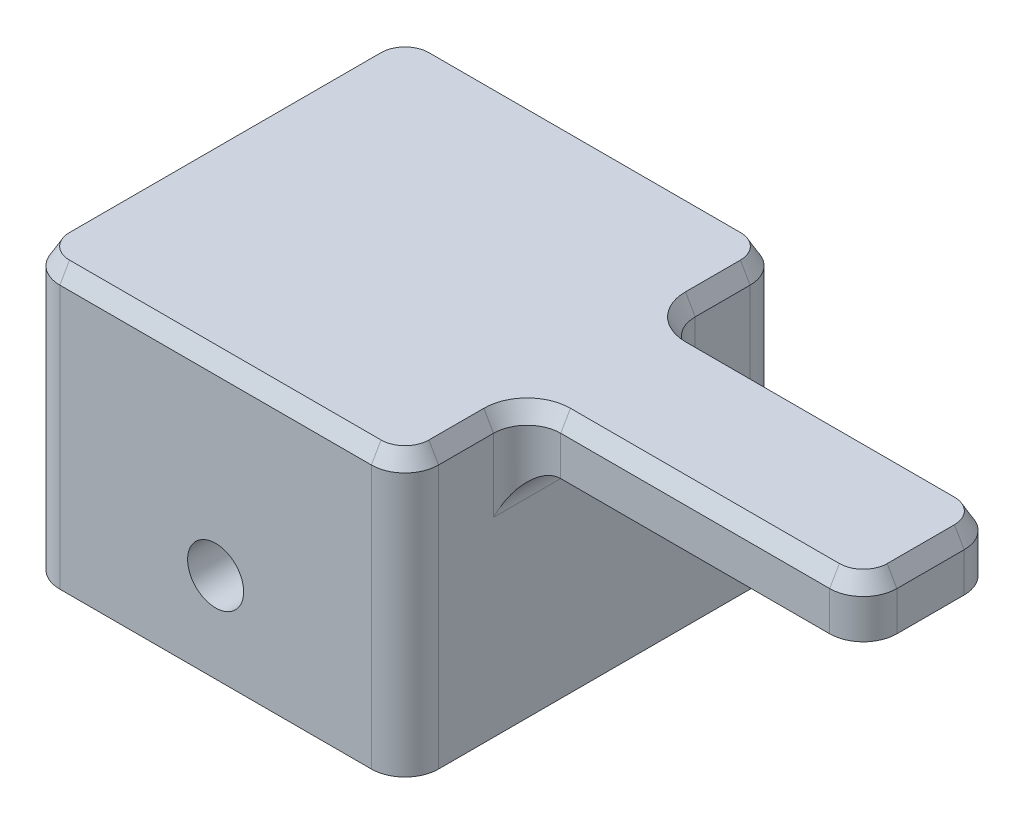
ISO-10303-21;
HEADER;
FILE_DESCRIPTION(('STEP AP214'),'2;1');
FILE_NAME('part.step','',(''),(''),'','','');
FILE_SCHEMA(('AUTOMOTIVE_DESIGN { 1 0 10303 214 1 1 1 1 }'));
ENDSEC;
DATA;
#1=APPLICATION_CONTEXT('core data for automotive mechanical design processes');
#2=APPLICATION_PROTOCOL_DEFINITION('international standard','automotive_design',2000,#1);
#3=PRODUCT_CONTEXT('',#1,'mechanical');
#4=PRODUCT('Part','Part','',(#3));
#5=PRODUCT_RELATED_PRODUCT_CATEGORY('part','',(#4));
#6=PRODUCT_DEFINITION_FORMATION('','',#4);
#7=PRODUCT_DEFINITION_CONTEXT('part definition',#1,'design');
#8=PRODUCT_DEFINITION('design','',#6,#7);
#9=PRODUCT_DEFINITION_SHAPE('','',#8);
#10=(LENGTH_UNIT() NAMED_UNIT(*) SI_UNIT(.MILLI.,.METRE.));
#11=(NAMED_UNIT(*) PLANE_ANGLE_UNIT() SI_UNIT($,.RADIAN.));
#12=(NAMED_UNIT(*) SI_UNIT($,.STERADIAN.) SOLID_ANGLE_UNIT());
#13=UNCERTAINTY_MEASURE_WITH_UNIT(LENGTH_MEASURE(1.E-05),#10,'distance_accuracy_value','');
#14=(GEOMETRIC_REPRESENTATION_CONTEXT(3) GLOBAL_UNCERTAINTY_ASSIGNED_CONTEXT((#13)) GLOBAL_UNIT_ASSIGNED_CONTEXT((#10,
#11,#12)) REPRESENTATION_CONTEXT('',''));
#15=CARTESIAN_POINT('',(0.,0.,0.));
#16=DIRECTION('',(0.,0.,1.));
#17=DIRECTION('',(1.,0.,0.));
#18=AXIS2_PLACEMENT_3D('',#15,#16,#17);
#19=CARTESIAN_POINT('',(0.,0.,0.));
#20=DIRECTION('',(0.,1.,0.));
#21=DIRECTION('',(0.,0.,1.));
#22=AXIS2_PLACEMENT_3D('',#19,#20,#21);
#23=PLANE('',#22);
#24=DIRECTION('',(0.,0.,-1.));
#25=VECTOR('',#24,1.);
#26=CARTESIAN_POINT('',(16.9,0.,16.9));
#27=LINE('',#26,#25);
#28=CARTESIAN_POINT('',(16.9,0.,13.9));
#29=VERTEX_POINT('',#28);
#30=CARTESIAN_POINT('',(16.9,0.,-13.9));
#31=VERTEX_POINT('',#30);
#32=EDGE_CURVE('E272',#29,#31,#27,.T.);
#33=ORIENTED_EDGE('',*,*,#32,.F.);
#34=CARTESIAN_POINT('',(13.9,0.,13.9));
#35=DIRECTION('',(0.,1.,0.));
#36=DIRECTION('',(0.,0.,1.));
#37=AXIS2_PLACEMENT_3D('',#34,#35,#36);
#38=CIRCLE('',#37,3.);
#39=CARTESIAN_POINT('',(13.9,0.,16.9));
#40=VERTEX_POINT('',#39);
#41=EDGE_CURVE('E310',#29,#40,#38,.F.);
#42=ORIENTED_EDGE('',*,*,#41,.T.);
#43=DIRECTION('',(1.,0.,0.));
#44=VECTOR('',#43,1.);
#45=CARTESIAN_POINT('',(-16.9,0.,16.9));
#46=LINE('',#45,#44);
#47=CARTESIAN_POINT('',(-13.9,0.,16.9));
#48=VERTEX_POINT('',#47);
#49=EDGE_CURVE('E263',#48,#40,#46,.T.);
#50=ORIENTED_EDGE('',*,*,#49,.F.);
#51=CARTESIAN_POINT('',(-13.9,0.,13.9));
#52=DIRECTION('',(0.,1.,0.));
#53=DIRECTION('',(0.,0.,1.));
#54=AXIS2_PLACEMENT_3D('',#51,#52,#53);
#55=CIRCLE('',#54,3.);
#56=CARTESIAN_POINT('',(-16.9,0.,13.9));
#57=VERTEX_POINT('',#56);
#58=EDGE_CURVE('E307',#48,#57,#55,.F.);
#59=ORIENTED_EDGE('',*,*,#58,.T.);
#60=DIRECTION('',(0.,0.,1.));
#61=VECTOR('',#60,1.);
#62=CARTESIAN_POINT('',(-16.9,0.,16.9));
#63=LINE('',#62,#61);
#64=CARTESIAN_POINT('',(-16.9,0.,-13.9));
#65=VERTEX_POINT('',#64);
#66=EDGE_CURVE('E280',#65,#57,#63,.T.);
#67=ORIENTED_EDGE('',*,*,#66,.F.);
#68=CARTESIAN_POINT('',(-13.9,0.,-13.9));
#69=DIRECTION('',(0.,1.,0.));
#70=DIRECTION('',(0.,0.,1.));
#71=AXIS2_PLACEMENT_3D('',#68,#69,#70);
#72=CIRCLE('',#71,3.);
#73=CARTESIAN_POINT('',(-13.9,0.,-16.9));
#74=VERTEX_POINT('',#73);
#75=EDGE_CURVE('E304',#65,#74,#72,.F.);
#76=ORIENTED_EDGE('',*,*,#75,.T.);
#77=DIRECTION('',(-1.,0.,0.));
#78=VECTOR('',#77,1.);
#79=CARTESIAN_POINT('',(-16.9,0.,-16.9));
#80=LINE('',#79,#78);
#81=CARTESIAN_POINT('',(13.9,0.,-16.9));
#82=VERTEX_POINT('',#81);
#83=EDGE_CURVE('E276',#82,#74,#80,.T.);
#84=ORIENTED_EDGE('',*,*,#83,.F.);
#85=CARTESIAN_POINT('',(13.9,0.,-13.9));
#86=DIRECTION('',(0.,1.,0.));
#87=DIRECTION('',(0.,0.,1.));
#88=AXIS2_PLACEMENT_3D('',#85,#86,#87);
#89=CIRCLE('',#88,3.);
#90=EDGE_CURVE('E301',#82,#31,#89,.F.);
#91=ORIENTED_EDGE('',*,*,#90,.T.);
#92=EDGE_LOOP('',(#33,#42,#50,#59,#67,#76,#84,#91));
#93=FACE_BOUND('',#92,.T.);
#94=DIRECTION('',(0.,0.,-1.));
#95=VECTOR('',#94,1.);
#96=CARTESIAN_POINT('',(12.9,0.,12.9));
#97=LINE('',#96,#95);
#98=CARTESIAN_POINT('',(12.9,0.,12.9));
#99=VERTEX_POINT('',#98);
#100=CARTESIAN_POINT('',(12.9,0.,-12.9));
#101=VERTEX_POINT('',#100);
#102=EDGE_CURVE('E555',#99,#101,#97,.T.);
#103=ORIENTED_EDGE('',*,*,#102,.T.);
#104=DIRECTION('',(-1.,0.,0.));
#105=VECTOR('',#104,1.);
#106=CARTESIAN_POINT('',(-12.9,0.,-12.9));
#107=LINE('',#106,#105);
#108=CARTESIAN_POINT('',(-12.9,0.,-12.9));
#109=VERTEX_POINT('',#108);
#110=EDGE_CURVE('E570',#101,#109,#107,.T.);
#111=ORIENTED_EDGE('',*,*,#110,.T.);
#112=DIRECTION('',(0.,0.,1.));
#113=VECTOR('',#112,1.);
#114=CARTESIAN_POINT('',(-12.9,0.,12.9));
#115=LINE('',#114,#113);
#116=CARTESIAN_POINT('',(-12.9,0.,12.9));
#117=VERTEX_POINT('',#116);
#118=EDGE_CURVE('E256',#109,#117,#115,.T.);
#119=ORIENTED_EDGE('',*,*,#118,.T.);
#120=DIRECTION('',(1.,0.,0.));
#121=VECTOR('',#120,1.);
#122=CARTESIAN_POINT('',(-12.9,0.,12.9));
#123=LINE('',#122,#121);
#124=EDGE_CURVE('E563',#117,#99,#123,.T.);
#125=ORIENTED_EDGE('',*,*,#124,.T.);
#126=EDGE_LOOP('',(#103,#111,#119,#125));
#127=FACE_BOUND('',#126,.T.);
#128=ADVANCED_FACE('F43',(#93,#127),#23,.F.);
#129=CARTESIAN_POINT('',(-16.9,20.,16.9));
#130=DIRECTION('',(0.,0.,-1.));
#131=DIRECTION('',(-1.,0.,0.));
#132=AXIS2_PLACEMENT_3D('',#129,#130,#131);
#133=PLANE('',#132);
#134=CARTESIAN_POINT('',(0.,8.,16.9));
#135=DIRECTION('',(0.,0.,1.));
#136=DIRECTION('',(1.,0.,0.));
#137=AXIS2_PLACEMENT_3D('',#134,#135,#136);
#138=CIRCLE('',#137,2.5);
#139=CARTESIAN_POINT('',(2.5,8.,16.9));
#140=VERTEX_POINT('',#139);
#141=EDGE_CURVE('E558',#140,#140,#138,.T.);
#142=ORIENTED_EDGE('',*,*,#141,.F.);
#143=EDGE_LOOP('',(#142));
#144=FACE_BOUND('',#143,.T.);
#145=DIRECTION('',(0.,-1.,0.));
#146=VECTOR('',#145,1.);
#147=CARTESIAN_POINT('',(13.9,20.,16.9));
#148=LINE('',#147,#146);
#149=CARTESIAN_POINT('',(13.9,23.5,16.9));
#150=VERTEX_POINT('',#149);
#151=EDGE_CURVE('E316',#40,#150,#148,.F.);
#152=ORIENTED_EDGE('',*,*,#151,.T.);
#153=DIRECTION('',(-1.,0.,0.));
#154=VECTOR('',#153,1.);
#155=CARTESIAN_POINT('',(-13.9,23.5,16.9));
#156=LINE('',#155,#154);
#157=CARTESIAN_POINT('',(-13.9,23.5,16.9));
#158=VERTEX_POINT('',#157);
#159=EDGE_CURVE('E11',#150,#158,#156,.T.);
#160=ORIENTED_EDGE('',*,*,#159,.T.);
#161=DIRECTION('',(0.,-1.,0.));
#162=VECTOR('',#161,1.);
#163=CARTESIAN_POINT('',(-13.9,20.,16.9));
#164=LINE('',#163,#162);
#165=EDGE_CURVE('E313',#158,#48,#164,.T.);
#166=ORIENTED_EDGE('',*,*,#165,.T.);
#167=ORIENTED_EDGE('',*,*,#49,.T.);
#168=EDGE_LOOP('',(#152,#160,#166,#167));
#169=FACE_BOUND('',#168,.T.);
#170=ADVANCED_FACE('F599',(#144,#169),#133,.F.);
#171=CARTESIAN_POINT('',(16.9,20.,16.9));
#172=DIRECTION('',(-1.,0.,0.));
#173=DIRECTION('',(0.,0.,1.));
#174=AXIS2_PLACEMENT_3D('',#171,#172,#173);
#175=PLANE('',#174);
#176=DIRECTION('',(0.,-1.,0.));
#177=VECTOR('',#176,1.);
#178=CARTESIAN_POINT('',(16.9,20.,-13.9));
#179=LINE('',#178,#177);
#180=CARTESIAN_POINT('',(16.9,23.5,-13.9));
#181=VERTEX_POINT('',#180);
#182=EDGE_CURVE('E294',#31,#181,#179,.F.);
#183=ORIENTED_EDGE('',*,*,#182,.T.);
#184=DIRECTION('',(0.,0.,1.));
#185=VECTOR('',#184,1.);
#186=CARTESIAN_POINT('',(16.9,23.5,-9.));
#187=LINE('',#186,#185);
#188=CARTESIAN_POINT('',(16.9,23.5,-9.));
#189=VERTEX_POINT('',#188);
#190=EDGE_CURVE('E439',#181,#189,#187,.T.);
#191=ORIENTED_EDGE('',*,*,#190,.T.);
#192=DIRECTION('',(0.,-1.,0.));
#193=VECTOR('',#192,1.);
#194=CARTESIAN_POINT('',(16.9,20.,-9.));
#195=LINE('',#194,#193);
#196=CARTESIAN_POINT('',(16.9,17.,-9.));
#197=VERTEX_POINT('',#196);
#198=EDGE_CURVE('E291',#189,#197,#195,.T.);
#199=ORIENTED_EDGE('',*,*,#198,.T.);
#200=DIRECTION('',(0.,0.,-1.));
#201=VECTOR('',#200,1.);
#202=CARTESIAN_POINT('',(16.9,17.,6.));
#203=LINE('',#202,#201);
#204=CARTESIAN_POINT('',(16.9,17.,9.));
#205=VERTEX_POINT('',#204);
#206=EDGE_CURVE('E284',#197,#205,#203,.F.);
#207=ORIENTED_EDGE('',*,*,#206,.T.);
#208=DIRECTION('',(0.,-1.,0.));
#209=VECTOR('',#208,1.);
#210=CARTESIAN_POINT('',(16.9,20.,9.));
#211=LINE('',#210,#209);
#212=CARTESIAN_POINT('',(16.9,23.5,9.));
#213=VERTEX_POINT('',#212);
#214=EDGE_CURVE('E287',#205,#213,#211,.F.);
#215=ORIENTED_EDGE('',*,*,#214,.T.);
#216=DIRECTION('',(0.,0.,1.));
#217=VECTOR('',#216,1.);
#218=CARTESIAN_POINT('',(16.9,23.5,13.9));
#219=LINE('',#218,#217);
#220=CARTESIAN_POINT('',(16.9,23.5,13.9));
#221=VERTEX_POINT('',#220);
#222=EDGE_CURVE('E436',#213,#221,#219,.T.);
#223=ORIENTED_EDGE('',*,*,#222,.T.);
#224=DIRECTION('',(0.,-1.,0.));
#225=VECTOR('',#224,1.);
#226=CARTESIAN_POINT('',(16.9,20.,13.9));
#227=LINE('',#226,#225);
#228=EDGE_CURVE('E298',#221,#29,#227,.T.);
#229=ORIENTED_EDGE('',*,*,#228,.T.);
#230=ORIENTED_EDGE('',*,*,#32,.T.);
#231=EDGE_LOOP('',(#183,#191,#199,#207,#215,#223,#229,#230));
#232=FACE_BOUND('',#231,.T.);
#233=ADVANCED_FACE('F604',(#232),#175,.F.);
#234=CARTESIAN_POINT('',(-16.9,20.,-16.9));
#235=DIRECTION('',(0.,0.,1.));
#236=DIRECTION('',(1.,0.,0.));
#237=AXIS2_PLACEMENT_3D('',#234,#235,#236);
#238=PLANE('',#237);
#239=DIRECTION('',(0.,-1.,0.));
#240=VECTOR('',#239,1.);
#241=CARTESIAN_POINT('',(-13.9,20.,-16.9));
#242=LINE('',#241,#240);
#243=CARTESIAN_POINT('',(-13.9,23.5,-16.9));
#244=VERTEX_POINT('',#243);
#245=EDGE_CURVE('E329',#74,#244,#242,.F.);
#246=ORIENTED_EDGE('',*,*,#245,.T.);
#247=DIRECTION('',(1.,0.,0.));
#248=VECTOR('',#247,1.);
#249=CARTESIAN_POINT('',(13.9,23.5,-16.9));
#250=LINE('',#249,#248);
#251=CARTESIAN_POINT('',(13.9,23.5,-16.9));
#252=VERTEX_POINT('',#251);
#253=EDGE_CURVE('E430',#244,#252,#250,.T.);
#254=ORIENTED_EDGE('',*,*,#253,.T.);
#255=DIRECTION('',(0.,-1.,0.));
#256=VECTOR('',#255,1.);
#257=CARTESIAN_POINT('',(13.9,20.,-16.9));
#258=LINE('',#257,#256);
#259=EDGE_CURVE('E326',#252,#82,#258,.T.);
#260=ORIENTED_EDGE('',*,*,#259,.T.);
#261=ORIENTED_EDGE('',*,*,#83,.T.);
#262=EDGE_LOOP('',(#246,#254,#260,#261));
#263=FACE_BOUND('',#262,.T.);
#264=ADVANCED_FACE('F594',(#263),#238,.F.);
#265=CARTESIAN_POINT('',(-16.9,20.,16.9));
#266=DIRECTION('',(1.,0.,0.));
#267=DIRECTION('',(0.,0.,-1.));
#268=AXIS2_PLACEMENT_3D('',#265,#266,#267);
#269=PLANE('',#268);
#270=DIRECTION('',(0.,-1.,0.));
#271=VECTOR('',#270,1.);
#272=CARTESIAN_POINT('',(-16.9,20.,13.9));
#273=LINE('',#272,#271);
#274=CARTESIAN_POINT('',(-16.9,23.5,13.9));
#275=VERTEX_POINT('',#274);
#276=EDGE_CURVE('E322',#57,#275,#273,.F.);
#277=ORIENTED_EDGE('',*,*,#276,.T.);
#278=DIRECTION('',(0.,0.,-1.));
#279=VECTOR('',#278,1.);
#280=CARTESIAN_POINT('',(-16.9,23.5,-13.9));
#281=LINE('',#280,#279);
#282=CARTESIAN_POINT('',(-16.9,23.5,-13.9));
#283=VERTEX_POINT('',#282);
#284=EDGE_CURVE('E424',#275,#283,#281,.T.);
#285=ORIENTED_EDGE('',*,*,#284,.T.);
#286=DIRECTION('',(0.,-1.,0.));
#287=VECTOR('',#286,1.);
#288=CARTESIAN_POINT('',(-16.9,20.,-13.9));
#289=LINE('',#288,#287);
#290=EDGE_CURVE('E319',#283,#65,#289,.T.);
#291=ORIENTED_EDGE('',*,*,#290,.T.);
#292=ORIENTED_EDGE('',*,*,#66,.T.);
#293=EDGE_LOOP('',(#277,#285,#291,#292));
#294=FACE_BOUND('',#293,.T.);
#295=ADVANCED_FACE('F587',(#294),#269,.F.);
#296=CARTESIAN_POINT('',(12.9,20.,12.9));
#297=DIRECTION('',(-1.,0.,0.));
#298=DIRECTION('',(0.,0.,1.));
#299=AXIS2_PLACEMENT_3D('',#296,#297,#298);
#300=PLANE('',#299);
#301=ORIENTED_EDGE('',*,*,#102,.F.);
#302=DIRECTION('',(0.,-1.,0.));
#303=VECTOR('',#302,1.);
#304=CARTESIAN_POINT('',(12.9,20.,12.9));
#305=LINE('',#304,#303);
#306=CARTESIAN_POINT('',(12.9,20.,12.9));
#307=VERTEX_POINT('',#306);
#308=EDGE_CURVE('E265',#307,#99,#305,.T.);
#309=ORIENTED_EDGE('',*,*,#308,.F.);
#310=DIRECTION('',(0.,0.,-1.));
#311=VECTOR('',#310,1.);
#312=CARTESIAN_POINT('',(12.9,20.,12.9));
#313=LINE('',#312,#311);
#314=CARTESIAN_POINT('',(12.9,20.,-12.9));
#315=VERTEX_POINT('',#314);
#316=EDGE_CURVE('E252',#307,#315,#313,.T.);
#317=ORIENTED_EDGE('',*,*,#316,.T.);
#318=DIRECTION('',(0.,-1.,0.));
#319=VECTOR('',#318,1.);
#320=CARTESIAN_POINT('',(12.9,20.,-12.9));
#321=LINE('',#320,#319);
#322=EDGE_CURVE('E250',#315,#101,#321,.T.);
#323=ORIENTED_EDGE('',*,*,#322,.T.);
#324=EDGE_LOOP('',(#301,#309,#317,#323));
#325=FACE_BOUND('',#324,.T.);
#326=ADVANCED_FACE('F585',(#325),#300,.T.);
#327=CARTESIAN_POINT('',(-12.9,20.,-12.9));
#328=DIRECTION('',(0.,0.,1.));
#329=DIRECTION('',(1.,0.,0.));
#330=AXIS2_PLACEMENT_3D('',#327,#328,#329);
#331=PLANE('',#330);
#332=ORIENTED_EDGE('',*,*,#110,.F.);
#333=ORIENTED_EDGE('',*,*,#322,.F.);
#334=DIRECTION('',(-1.,0.,0.));
#335=VECTOR('',#334,1.);
#336=CARTESIAN_POINT('',(-12.9,20.,-12.9));
#337=LINE('',#336,#335);
#338=CARTESIAN_POINT('',(-12.9,20.,-12.9));
#339=VERTEX_POINT('',#338);
#340=EDGE_CURVE('E235',#315,#339,#337,.T.);
#341=ORIENTED_EDGE('',*,*,#340,.T.);
#342=DIRECTION('',(0.,-1.,0.));
#343=VECTOR('',#342,1.);
#344=CARTESIAN_POINT('',(-12.9,20.,-12.9));
#345=LINE('',#344,#343);
#346=EDGE_CURVE('E247',#339,#109,#345,.T.);
#347=ORIENTED_EDGE('',*,*,#346,.T.);
#348=EDGE_LOOP('',(#332,#333,#341,#347));
#349=FACE_BOUND('',#348,.T.);
#350=ADVANCED_FACE('F246',(#349),#331,.T.);
#351=CARTESIAN_POINT('',(-12.9,20.,12.9));
#352=DIRECTION('',(1.,0.,0.));
#353=DIRECTION('',(0.,0.,-1.));
#354=AXIS2_PLACEMENT_3D('',#351,#352,#353);
#355=PLANE('',#354);
#356=ORIENTED_EDGE('',*,*,#118,.F.);
#357=ORIENTED_EDGE('',*,*,#346,.F.);
#358=DIRECTION('',(0.,0.,1.));
#359=VECTOR('',#358,1.);
#360=CARTESIAN_POINT('',(-12.9,20.,12.9));
#361=LINE('',#360,#359);
#362=CARTESIAN_POINT('',(-12.9,20.,12.9));
#363=VERTEX_POINT('',#362);
#364=EDGE_CURVE('E232',#339,#363,#361,.T.);
#365=ORIENTED_EDGE('',*,*,#364,.T.);
#366=DIRECTION('',(0.,-1.,0.));
#367=VECTOR('',#366,1.);
#368=CARTESIAN_POINT('',(-12.9,20.,12.9));
#369=LINE('',#368,#367);
#370=EDGE_CURVE('E259',#363,#117,#369,.T.);
#371=ORIENTED_EDGE('',*,*,#370,.T.);
#372=EDGE_LOOP('',(#356,#357,#365,#371));
#373=FACE_BOUND('',#372,.T.);
#374=ADVANCED_FACE('F254',(#373),#355,.T.);
#375=CARTESIAN_POINT('',(-12.9,20.,12.9));
#376=DIRECTION('',(0.,0.,-1.));
#377=DIRECTION('',(-1.,0.,0.));
#378=AXIS2_PLACEMENT_3D('',#375,#376,#377);
#379=PLANE('',#378);
#380=CARTESIAN_POINT('',(0.,8.,12.9));
#381=DIRECTION('',(0.,0.,-1.));
#382=DIRECTION('',(-1.,0.,0.));
#383=AXIS2_PLACEMENT_3D('',#380,#381,#382);
#384=CIRCLE('',#383,2.5);
#385=CARTESIAN_POINT('',(-2.5,8.,12.9));
#386=VERTEX_POINT('',#385);
#387=EDGE_CURVE('E371',#386,#386,#384,.F.);
#388=ORIENTED_EDGE('',*,*,#387,.T.);
#389=EDGE_LOOP('',(#388));
#390=FACE_BOUND('',#389,.T.);
#391=ORIENTED_EDGE('',*,*,#124,.F.);
#392=ORIENTED_EDGE('',*,*,#370,.F.);
#393=DIRECTION('',(1.,0.,0.));
#394=VECTOR('',#393,1.);
#395=CARTESIAN_POINT('',(-12.9,20.,12.9));
#396=LINE('',#395,#394);
#397=EDGE_CURVE('E238',#363,#307,#396,.T.);
#398=ORIENTED_EDGE('',*,*,#397,.T.);
#399=ORIENTED_EDGE('',*,*,#308,.T.);
#400=EDGE_LOOP('',(#391,#392,#398,#399));
#401=FACE_BOUND('',#400,.T.);
#402=ADVANCED_FACE('F582',(#390,#401),#379,.T.);
#403=CARTESIAN_POINT('',(0.,20.,0.));
#404=DIRECTION('',(0.,1.,0.));
#405=DIRECTION('',(0.,0.,1.));
#406=AXIS2_PLACEMENT_3D('',#403,#404,#405);
#407=PLANE('',#406);
#408=ORIENTED_EDGE('',*,*,#340,.F.);
#409=ORIENTED_EDGE('',*,*,#316,.F.);
#410=ORIENTED_EDGE('',*,*,#397,.F.);
#411=ORIENTED_EDGE('',*,*,#364,.F.);
#412=EDGE_LOOP('',(#408,#409,#410,#411));
#413=FACE_BOUND('',#412,.T.);
#414=ADVANCED_FACE('F234',(#413),#407,.F.);
#415=DIRECTION('',(-1.,0.,0.));
#416=VECTOR('',#415,1.);
#417=CARTESIAN_POINT('',(0.,20.,6.));
#418=LINE('',#417,#416);
#419=CARTESIAN_POINT('',(43.9,20.,6.));
#420=VERTEX_POINT('',#419);
#421=CARTESIAN_POINT('',(19.9,20.,6.));
#422=VERTEX_POINT('',#421);
#423=EDGE_CURVE('E550',#420,#422,#418,.T.);
#424=ORIENTED_EDGE('',*,*,#423,.T.);
#425=DIRECTION('',(0.,0.,-1.));
#426=VECTOR('',#425,1.);
#427=CARTESIAN_POINT('',(19.9,20.,-6.));
#428=LINE('',#427,#426);
#429=CARTESIAN_POINT('',(19.9,20.,-6.));
#430=VERTEX_POINT('',#429);
#431=EDGE_CURVE('E352',#422,#430,#428,.T.);
#432=ORIENTED_EDGE('',*,*,#431,.T.);
#433=DIRECTION('',(1.,0.,0.));
#434=VECTOR('',#433,1.);
#435=CARTESIAN_POINT('',(0.,20.,-6.));
#436=LINE('',#435,#434);
#437=CARTESIAN_POINT('',(43.9,20.,-6.));
#438=VERTEX_POINT('',#437);
#439=EDGE_CURVE('E549',#430,#438,#436,.T.);
#440=ORIENTED_EDGE('',*,*,#439,.T.);
#441=CARTESIAN_POINT('',(43.9,20.,-3.));
#442=DIRECTION('',(0.,1.,0.));
#443=DIRECTION('',(0.,0.,1.));
#444=AXIS2_PLACEMENT_3D('',#441,#442,#443);
#445=CIRCLE('',#444,3.);
#446=CARTESIAN_POINT('',(46.9,20.,-3.));
#447=VERTEX_POINT('',#446);
#448=EDGE_CURVE('E349',#438,#447,#445,.F.);
#449=ORIENTED_EDGE('',*,*,#448,.T.);
#450=DIRECTION('',(0.,0.,1.));
#451=VECTOR('',#450,1.);
#452=CARTESIAN_POINT('',(46.9,20.,0.));
#453=LINE('',#452,#451);
#454=CARTESIAN_POINT('',(46.9,20.,3.));
#455=VERTEX_POINT('',#454);
#456=EDGE_CURVE('E545',#447,#455,#453,.T.);
#457=ORIENTED_EDGE('',*,*,#456,.T.);
#458=CARTESIAN_POINT('',(43.9,20.,3.));
#459=DIRECTION('',(0.,1.,0.));
#460=DIRECTION('',(0.,0.,1.));
#461=AXIS2_PLACEMENT_3D('',#458,#459,#460);
#462=CIRCLE('',#461,3.);
#463=EDGE_CURVE('E346',#455,#420,#462,.F.);
#464=ORIENTED_EDGE('',*,*,#463,.T.);
#465=EDGE_LOOP('',(#424,#432,#440,#449,#457,#464));
#466=FACE_BOUND('',#465,.T.);
#467=ADVANCED_FACE('F829',(#466),#407,.F.);
#468=CARTESIAN_POINT('',(0.,25.,6.));
#469=DIRECTION('',(0.,0.,1.));
#470=DIRECTION('',(1.,0.,0.));
#471=AXIS2_PLACEMENT_3D('',#468,#469,#470);
#472=PLANE('',#471);
#473=DIRECTION('',(0.,-1.,0.));
#474=VECTOR('',#473,1.);
#475=CARTESIAN_POINT('',(43.9,25.,6.));
#476=LINE('',#475,#474);
#477=CARTESIAN_POINT('',(43.9,23.5,6.));
#478=VERTEX_POINT('',#477);
#479=EDGE_CURVE('E340',#420,#478,#476,.F.);
#480=ORIENTED_EDGE('',*,*,#479,.T.);
#481=DIRECTION('',(-1.,0.,0.));
#482=VECTOR('',#481,1.);
#483=CARTESIAN_POINT('',(0.,23.5,6.));
#484=LINE('',#483,#482);
#485=CARTESIAN_POINT('',(19.9,23.5,6.));
#486=VERTEX_POINT('',#485);
#487=EDGE_CURVE('E69',#478,#486,#484,.T.);
#488=ORIENTED_EDGE('',*,*,#487,.T.);
#489=DIRECTION('',(0.,-1.,0.));
#490=VECTOR('',#489,1.);
#491=CARTESIAN_POINT('',(19.9,25.,6.));
#492=LINE('',#491,#490);
#493=EDGE_CURVE('E343',#486,#422,#492,.T.);
#494=ORIENTED_EDGE('',*,*,#493,.T.);
#495=ORIENTED_EDGE('',*,*,#423,.F.);
#496=EDGE_LOOP('',(#480,#488,#494,#495));
#497=FACE_BOUND('',#496,.T.);
#498=ADVANCED_FACE('F822',(#497),#472,.T.);
#499=CARTESIAN_POINT('',(46.9,25.,0.));
#500=DIRECTION('',(1.,0.,0.));
#501=DIRECTION('',(0.,0.,-1.));
#502=AXIS2_PLACEMENT_3D('',#499,#500,#501);
#503=PLANE('',#502);
#504=DIRECTION('',(0.,-1.,0.));
#505=VECTOR('',#504,1.);
#506=CARTESIAN_POINT('',(46.9,25.,-3.));
#507=LINE('',#506,#505);
#508=CARTESIAN_POINT('',(46.9,23.5,-3.));
#509=VERTEX_POINT('',#508);
#510=EDGE_CURVE('E358',#447,#509,#507,.F.);
#511=ORIENTED_EDGE('',*,*,#510,.T.);
#512=DIRECTION('',(0.,0.,1.));
#513=VECTOR('',#512,1.);
#514=CARTESIAN_POINT('',(46.9,23.5,0.));
#515=LINE('',#514,#513);
#516=CARTESIAN_POINT('',(46.9,23.5,3.));
#517=VERTEX_POINT('',#516);
#518=EDGE_CURVE('E451',#509,#517,#515,.T.);
#519=ORIENTED_EDGE('',*,*,#518,.T.);
#520=DIRECTION('',(0.,-1.,0.));
#521=VECTOR('',#520,1.);
#522=CARTESIAN_POINT('',(46.9,25.,3.));
#523=LINE('',#522,#521);
#524=EDGE_CURVE('E355',#517,#455,#523,.T.);
#525=ORIENTED_EDGE('',*,*,#524,.T.);
#526=ORIENTED_EDGE('',*,*,#456,.F.);
#527=EDGE_LOOP('',(#511,#519,#525,#526));
#528=FACE_BOUND('',#527,.T.);
#529=ADVANCED_FACE('F542',(#528),#503,.T.);
#530=CARTESIAN_POINT('',(0.,25.,-6.));
#531=DIRECTION('',(0.,0.,-1.));
#532=DIRECTION('',(-1.,0.,0.));
#533=AXIS2_PLACEMENT_3D('',#530,#531,#532);
#534=PLANE('',#533);
#535=DIRECTION('',(0.,-1.,0.));
#536=VECTOR('',#535,1.);
#537=CARTESIAN_POINT('',(19.9,25.,-6.));
#538=LINE('',#537,#536);
#539=CARTESIAN_POINT('',(19.9,23.5,-6.));
#540=VERTEX_POINT('',#539);
#541=EDGE_CURVE('E336',#430,#540,#538,.F.);
#542=ORIENTED_EDGE('',*,*,#541,.T.);
#543=DIRECTION('',(1.,0.,0.));
#544=VECTOR('',#543,1.);
#545=CARTESIAN_POINT('',(0.,23.5,-6.));
#546=LINE('',#545,#544);
#547=CARTESIAN_POINT('',(43.9,23.5,-6.));
#548=VERTEX_POINT('',#547);
#549=EDGE_CURVE('E445',#540,#548,#546,.T.);
#550=ORIENTED_EDGE('',*,*,#549,.T.);
#551=DIRECTION('',(0.,-1.,0.));
#552=VECTOR('',#551,1.);
#553=CARTESIAN_POINT('',(43.9,25.,-6.));
#554=LINE('',#553,#552);
#555=EDGE_CURVE('E333',#548,#438,#554,.T.);
#556=ORIENTED_EDGE('',*,*,#555,.T.);
#557=ORIENTED_EDGE('',*,*,#439,.F.);
#558=EDGE_LOOP('',(#542,#550,#556,#557));
#559=FACE_BOUND('',#558,.T.);
#560=ADVANCED_FACE('F807',(#559),#534,.T.);
#561=CARTESIAN_POINT('',(0.,25.,0.));
#562=DIRECTION('',(0.,1.,0.));
#563=DIRECTION('',(0.,0.,1.));
#564=AXIS2_PLACEMENT_3D('',#561,#562,#563);
#565=PLANE('',#564);
#566=DIRECTION('',(0.,0.,1.));
#567=VECTOR('',#566,1.);
#568=CARTESIAN_POINT('',(-16.0339745962156,25.,13.9));
#569=LINE('',#568,#567);
#570=CARTESIAN_POINT('',(-16.0339745962156,25.,-13.9));
#571=VERTEX_POINT('',#570);
#572=CARTESIAN_POINT('',(-16.0339745962156,25.,13.9));
#573=VERTEX_POINT('',#572);
#574=EDGE_CURVE('E413',#571,#573,#569,.T.);
#575=ORIENTED_EDGE('',*,*,#574,.T.);
#576=CARTESIAN_POINT('',(-13.9,25.,13.9));
#577=DIRECTION('',(0.,1.,0.));
#578=DIRECTION('',(0.,0.,1.));
#579=AXIS2_PLACEMENT_3D('',#576,#577,#578);
#580=CIRCLE('',#579,2.13397459621556);
#581=CARTESIAN_POINT('',(-13.9,25.,16.0339745962156));
#582=VERTEX_POINT('',#581);
#583=EDGE_CURVE('E416',#573,#582,#580,.T.);
#584=ORIENTED_EDGE('',*,*,#583,.T.);
#585=DIRECTION('',(1.,0.,0.));
#586=VECTOR('',#585,1.);
#587=CARTESIAN_POINT('',(13.9,25.,16.0339745962156));
#588=LINE('',#587,#586);
#589=CARTESIAN_POINT('',(13.9,25.,16.0339745962156));
#590=VERTEX_POINT('',#589);
#591=EDGE_CURVE('E362',#582,#590,#588,.T.);
#592=ORIENTED_EDGE('',*,*,#591,.T.);
#593=CARTESIAN_POINT('',(13.9,25.,13.9));
#594=DIRECTION('',(0.,1.,0.));
#595=DIRECTION('',(0.,0.,1.));
#596=AXIS2_PLACEMENT_3D('',#593,#594,#595);
#597=CIRCLE('',#596,2.13397459621556);
#598=CARTESIAN_POINT('',(16.0339745962156,25.,13.9));
#599=VERTEX_POINT('',#598);
#600=EDGE_CURVE('E374',#590,#599,#597,.T.);
#601=ORIENTED_EDGE('',*,*,#600,.T.);
#602=DIRECTION('',(0.,0.,-1.));
#603=VECTOR('',#602,1.);
#604=CARTESIAN_POINT('',(16.0339745962156,25.,9.));
#605=LINE('',#604,#603);
#606=CARTESIAN_POINT('',(16.0339745962156,25.,9.));
#607=VERTEX_POINT('',#606);
#608=EDGE_CURVE('E377',#599,#607,#605,.T.);
#609=ORIENTED_EDGE('',*,*,#608,.T.);
#610=CARTESIAN_POINT('',(19.9,25.,9.));
#611=DIRECTION('',(0.,1.,0.));
#612=DIRECTION('',(0.,0.,1.));
#613=AXIS2_PLACEMENT_3D('',#610,#611,#612);
#614=CIRCLE('',#613,3.86602540378444);
#615=CARTESIAN_POINT('',(19.9,25.,5.13397459621556));
#616=VERTEX_POINT('',#615);
#617=EDGE_CURVE('E380',#607,#616,#614,.F.);
#618=ORIENTED_EDGE('',*,*,#617,.T.);
#619=DIRECTION('',(1.,0.,0.));
#620=VECTOR('',#619,1.);
#621=CARTESIAN_POINT('',(0.,25.,5.13397459621556));
#622=LINE('',#621,#620);
#623=CARTESIAN_POINT('',(43.9,25.,5.13397459621556));
#624=VERTEX_POINT('',#623);
#625=EDGE_CURVE('E383',#616,#624,#622,.T.);
#626=ORIENTED_EDGE('',*,*,#625,.T.);
#627=CARTESIAN_POINT('',(43.9,25.,3.));
#628=DIRECTION('',(0.,1.,0.));
#629=DIRECTION('',(0.,0.,1.));
#630=AXIS2_PLACEMENT_3D('',#627,#628,#629);
#631=CIRCLE('',#630,2.13397459621556);
#632=CARTESIAN_POINT('',(46.0339745962156,25.,3.));
#633=VERTEX_POINT('',#632);
#634=EDGE_CURVE('E386',#624,#633,#631,.T.);
#635=ORIENTED_EDGE('',*,*,#634,.T.);
#636=DIRECTION('',(0.,0.,-1.));
#637=VECTOR('',#636,1.);
#638=CARTESIAN_POINT('',(46.0339745962156,25.,0.));
#639=LINE('',#638,#637);
#640=CARTESIAN_POINT('',(46.0339745962156,25.,-3.));
#641=VERTEX_POINT('',#640);
#642=EDGE_CURVE('E389',#633,#641,#639,.T.);
#643=ORIENTED_EDGE('',*,*,#642,.T.);
#644=CARTESIAN_POINT('',(43.9,25.,-3.));
#645=DIRECTION('',(0.,1.,0.));
#646=DIRECTION('',(0.,0.,1.));
#647=AXIS2_PLACEMENT_3D('',#644,#645,#646);
#648=CIRCLE('',#647,2.13397459621556);
#649=CARTESIAN_POINT('',(43.9,25.,-5.13397459621556));
#650=VERTEX_POINT('',#649);
#651=EDGE_CURVE('E392',#641,#650,#648,.T.);
#652=ORIENTED_EDGE('',*,*,#651,.T.);
#653=DIRECTION('',(-1.,0.,0.));
#654=VECTOR('',#653,1.);
#655=CARTESIAN_POINT('',(0.,25.,-5.13397459621556));
#656=LINE('',#655,#654);
#657=CARTESIAN_POINT('',(19.9,25.,-5.13397459621556));
#658=VERTEX_POINT('',#657);
#659=EDGE_CURVE('E395',#650,#658,#656,.T.);
#660=ORIENTED_EDGE('',*,*,#659,.T.);
#661=CARTESIAN_POINT('',(19.9,25.,-9.));
#662=DIRECTION('',(0.,1.,0.));
#663=DIRECTION('',(0.,0.,1.));
#664=AXIS2_PLACEMENT_3D('',#661,#662,#663);
#665=CIRCLE('',#664,3.86602540378444);
#666=CARTESIAN_POINT('',(16.0339745962156,25.,-9.));
#667=VERTEX_POINT('',#666);
#668=EDGE_CURVE('E398',#658,#667,#665,.F.);
#669=ORIENTED_EDGE('',*,*,#668,.T.);
#670=DIRECTION('',(0.,0.,-1.));
#671=VECTOR('',#670,1.);
#672=CARTESIAN_POINT('',(16.0339745962156,25.,-13.9));
#673=LINE('',#672,#671);
#674=CARTESIAN_POINT('',(16.0339745962156,25.,-13.9));
#675=VERTEX_POINT('',#674);
#676=EDGE_CURVE('E401',#667,#675,#673,.T.);
#677=ORIENTED_EDGE('',*,*,#676,.T.);
#678=CARTESIAN_POINT('',(13.9,25.,-13.9));
#679=DIRECTION('',(0.,1.,0.));
#680=DIRECTION('',(0.,0.,1.));
#681=AXIS2_PLACEMENT_3D('',#678,#679,#680);
#682=CIRCLE('',#681,2.13397459621556);
#683=CARTESIAN_POINT('',(13.9,25.,-16.0339745962156));
#684=VERTEX_POINT('',#683);
#685=EDGE_CURVE('E404',#675,#684,#682,.T.);
#686=ORIENTED_EDGE('',*,*,#685,.T.);
#687=DIRECTION('',(-1.,0.,0.));
#688=VECTOR('',#687,1.);
#689=CARTESIAN_POINT('',(-13.9,25.,-16.0339745962156));
#690=LINE('',#689,#688);
#691=CARTESIAN_POINT('',(-13.9,25.,-16.0339745962156));
#692=VERTEX_POINT('',#691);
#693=EDGE_CURVE('E407',#684,#692,#690,.T.);
#694=ORIENTED_EDGE('',*,*,#693,.T.);
#695=CARTESIAN_POINT('',(-13.9,25.,-13.9));
#696=DIRECTION('',(0.,1.,0.));
#697=DIRECTION('',(0.,0.,1.));
#698=AXIS2_PLACEMENT_3D('',#695,#696,#697);
#699=CIRCLE('',#698,2.13397459621556);
#700=EDGE_CURVE('E410',#692,#571,#699,.T.);
#701=ORIENTED_EDGE('',*,*,#700,.T.);
#702=EDGE_LOOP('',(#575,#584,#592,#601,#609,#618,#626,#635,#643,#652,#660,#669,#677,#686,#694,#701));
#703=FACE_BOUND('',#702,.T.);
#704=ADVANCED_FACE('F799',(#703),#565,.T.);
#705=CARTESIAN_POINT('',(0.,8.,-16.901));
#706=DIRECTION('',(0.,0.,1.));
#707=DIRECTION('',(1.,0.,0.));
#708=AXIS2_PLACEMENT_3D('',#705,#706,#707);
#709=CYLINDRICAL_SURFACE('',#708,2.5);
#710=ORIENTED_EDGE('',*,*,#387,.F.);
#711=EDGE_LOOP('',(#710));
#712=FACE_BOUND('',#711,.T.);
#713=ORIENTED_EDGE('',*,*,#141,.T.);
#714=EDGE_LOOP('',(#713));
#715=FACE_BOUND('',#714,.T.);
#716=ADVANCED_FACE('F619',(#712,#715),#709,.F.);
#717=CARTESIAN_POINT('',(13.9,20.,13.9));
#718=DIRECTION('',(0.,-1.,0.));
#719=DIRECTION('',(0.,0.,-1.));
#720=AXIS2_PLACEMENT_3D('',#717,#718,#719);
#721=CYLINDRICAL_SURFACE('',#720,3.);
#722=ORIENTED_EDGE('',*,*,#228,.F.);
#723=CARTESIAN_POINT('',(13.9,23.5,13.9));
#724=DIRECTION('',(0.,1.,0.));
#725=DIRECTION('',(0.,0.,1.));
#726=AXIS2_PLACEMENT_3D('',#723,#724,#725);
#727=CIRCLE('',#726,3.);
#728=EDGE_CURVE('E54',#221,#150,#727,.F.);
#729=ORIENTED_EDGE('',*,*,#728,.T.);
#730=ORIENTED_EDGE('',*,*,#151,.F.);
#731=ORIENTED_EDGE('',*,*,#41,.F.);
#732=EDGE_LOOP('',(#722,#729,#730,#731));
#733=FACE_BOUND('',#732,.T.);
#734=ADVANCED_FACE('F615',(#733),#721,.T.);
#735=CARTESIAN_POINT('',(-13.9,20.,13.9));
#736=DIRECTION('',(0.,-1.,0.));
#737=DIRECTION('',(0.,0.,-1.));
#738=AXIS2_PLACEMENT_3D('',#735,#736,#737);
#739=CYLINDRICAL_SURFACE('',#738,3.);
#740=ORIENTED_EDGE('',*,*,#165,.F.);
#741=CARTESIAN_POINT('',(-13.9,23.5,13.9));
#742=DIRECTION('',(0.,1.,0.));
#743=DIRECTION('',(0.,0.,1.));
#744=AXIS2_PLACEMENT_3D('',#741,#742,#743);
#745=CIRCLE('',#744,3.);
#746=EDGE_CURVE('E420',#158,#275,#745,.F.);
#747=ORIENTED_EDGE('',*,*,#746,.T.);
#748=ORIENTED_EDGE('',*,*,#276,.F.);
#749=ORIENTED_EDGE('',*,*,#58,.F.);
#750=EDGE_LOOP('',(#740,#747,#748,#749));
#751=FACE_BOUND('',#750,.T.);
#752=ADVANCED_FACE('F618',(#751),#739,.T.);
#753=CARTESIAN_POINT('',(-13.9,20.,-13.9));
#754=DIRECTION('',(0.,-1.,0.));
#755=DIRECTION('',(0.,0.,-1.));
#756=AXIS2_PLACEMENT_3D('',#753,#754,#755);
#757=CYLINDRICAL_SURFACE('',#756,3.);
#758=ORIENTED_EDGE('',*,*,#290,.F.);
#759=CARTESIAN_POINT('',(-13.9,23.5,-13.9));
#760=DIRECTION('',(0.,1.,0.));
#761=DIRECTION('',(0.,0.,1.));
#762=AXIS2_PLACEMENT_3D('',#759,#760,#761);
#763=CIRCLE('',#762,3.);
#764=EDGE_CURVE('E427',#283,#244,#763,.F.);
#765=ORIENTED_EDGE('',*,*,#764,.T.);
#766=ORIENTED_EDGE('',*,*,#245,.F.);
#767=ORIENTED_EDGE('',*,*,#75,.F.);
#768=EDGE_LOOP('',(#758,#765,#766,#767));
#769=FACE_BOUND('',#768,.T.);
#770=ADVANCED_FACE('F622',(#769),#757,.T.);
#771=CARTESIAN_POINT('',(13.9,20.,-13.9));
#772=DIRECTION('',(0.,-1.,0.));
#773=DIRECTION('',(0.,0.,-1.));
#774=AXIS2_PLACEMENT_3D('',#771,#772,#773);
#775=CYLINDRICAL_SURFACE('',#774,3.);
#776=ORIENTED_EDGE('',*,*,#259,.F.);
#777=CARTESIAN_POINT('',(13.9,23.5,-13.9));
#778=DIRECTION('',(0.,1.,0.));
#779=DIRECTION('',(0.,0.,1.));
#780=AXIS2_PLACEMENT_3D('',#777,#778,#779);
#781=CIRCLE('',#780,3.);
#782=EDGE_CURVE('E433',#252,#181,#781,.F.);
#783=ORIENTED_EDGE('',*,*,#782,.T.);
#784=ORIENTED_EDGE('',*,*,#182,.F.);
#785=ORIENTED_EDGE('',*,*,#90,.F.);
#786=EDGE_LOOP('',(#776,#783,#784,#785));
#787=FACE_BOUND('',#786,.T.);
#788=ADVANCED_FACE('F626',(#787),#775,.T.);
#789=CARTESIAN_POINT('',(19.9,25.,9.));
#790=DIRECTION('',(0.,-1.,0.));
#791=DIRECTION('',(0.,0.,-1.));
#792=AXIS2_PLACEMENT_3D('',#789,#790,#791);
#793=CYLINDRICAL_SURFACE('',#792,3.);
#794=ORIENTED_EDGE('',*,*,#493,.F.);
#795=CARTESIAN_POINT('',(19.9,23.5,9.));
#796=DIRECTION('',(0.,1.,0.));
#797=DIRECTION('',(0.,0.,1.));
#798=AXIS2_PLACEMENT_3D('',#795,#796,#797);
#799=CIRCLE('',#798,3.);
#800=EDGE_CURVE('E459',#486,#213,#799,.T.);
#801=ORIENTED_EDGE('',*,*,#800,.T.);
#802=ORIENTED_EDGE('',*,*,#214,.F.);
#803=CARTESIAN_POINT('',(19.9,17.,9.));
#804=DIRECTION('',(0.,0.707106781186547,0.707106781186547));
#805=DIRECTION('',(0.,-0.707106781186547,0.707106781186547));
#806=AXIS2_PLACEMENT_3D('',#803,#804,#805);
#807=ELLIPSE('',#806,4.24264068711928,3.);
#808=EDGE_CURVE('E367',#422,#205,#807,.T.);
#809=ORIENTED_EDGE('',*,*,#808,.F.);
#810=EDGE_LOOP('',(#794,#801,#802,#809));
#811=FACE_BOUND('',#810,.T.);
#812=ADVANCED_FACE('F630',(#811),#793,.F.);
#813=CARTESIAN_POINT('',(19.9,17.,0.));
#814=DIRECTION('',(0.,0.,1.));
#815=DIRECTION('',(1.,0.,0.));
#816=AXIS2_PLACEMENT_3D('',#813,#814,#815);
#817=CYLINDRICAL_SURFACE('',#816,3.);
#818=ORIENTED_EDGE('',*,*,#808,.T.);
#819=ORIENTED_EDGE('',*,*,#206,.F.);
#820=CARTESIAN_POINT('',(19.9,17.,-9.));
#821=DIRECTION('',(0.,-0.707106781186547,0.707106781186547));
#822=DIRECTION('',(0.,0.707106781186547,0.707106781186547));
#823=AXIS2_PLACEMENT_3D('',#820,#821,#822);
#824=ELLIPSE('',#823,4.24264068711928,3.);
#825=EDGE_CURVE('E363',#430,#197,#824,.T.);
#826=ORIENTED_EDGE('',*,*,#825,.F.);
#827=ORIENTED_EDGE('',*,*,#431,.F.);
#828=EDGE_LOOP('',(#818,#819,#826,#827));
#829=FACE_BOUND('',#828,.T.);
#830=ADVANCED_FACE('F635',(#829),#817,.F.);
#831=CARTESIAN_POINT('',(19.9,20.,-9.));
#832=DIRECTION('',(0.,-1.,0.));
#833=DIRECTION('',(0.,0.,-1.));
#834=AXIS2_PLACEMENT_3D('',#831,#832,#833);
#835=CYLINDRICAL_SURFACE('',#834,3.);
#836=ORIENTED_EDGE('',*,*,#198,.F.);
#837=CARTESIAN_POINT('',(19.9,23.5,-9.));
#838=DIRECTION('',(0.,1.,0.));
#839=DIRECTION('',(0.,0.,1.));
#840=AXIS2_PLACEMENT_3D('',#837,#838,#839);
#841=CIRCLE('',#840,3.);
#842=EDGE_CURVE('E442',#189,#540,#841,.T.);
#843=ORIENTED_EDGE('',*,*,#842,.T.);
#844=ORIENTED_EDGE('',*,*,#541,.F.);
#845=ORIENTED_EDGE('',*,*,#825,.T.);
#846=EDGE_LOOP('',(#836,#843,#844,#845));
#847=FACE_BOUND('',#846,.T.);
#848=ADVANCED_FACE('F632',(#847),#835,.F.);
#849=CARTESIAN_POINT('',(43.9,25.,-3.));
#850=DIRECTION('',(0.,-1.,0.));
#851=DIRECTION('',(0.,0.,-1.));
#852=AXIS2_PLACEMENT_3D('',#849,#850,#851);
#853=CYLINDRICAL_SURFACE('',#852,3.);
#854=ORIENTED_EDGE('',*,*,#555,.F.);
#855=CARTESIAN_POINT('',(43.9,23.5,-3.));
#856=DIRECTION('',(0.,1.,0.));
#857=DIRECTION('',(0.,0.,1.));
#858=AXIS2_PLACEMENT_3D('',#855,#856,#857);
#859=CIRCLE('',#858,3.);
#860=EDGE_CURVE('E448',#548,#509,#859,.F.);
#861=ORIENTED_EDGE('',*,*,#860,.T.);
#862=ORIENTED_EDGE('',*,*,#510,.F.);
#863=ORIENTED_EDGE('',*,*,#448,.F.);
#864=EDGE_LOOP('',(#854,#861,#862,#863));
#865=FACE_BOUND('',#864,.T.);
#866=ADVANCED_FACE('F538',(#865),#853,.T.);
#867=CARTESIAN_POINT('',(43.9,25.,3.));
#868=DIRECTION('',(0.,-1.,0.));
#869=DIRECTION('',(0.,0.,-1.));
#870=AXIS2_PLACEMENT_3D('',#867,#868,#869);
#871=CYLINDRICAL_SURFACE('',#870,3.);
#872=ORIENTED_EDGE('',*,*,#524,.F.);
#873=CARTESIAN_POINT('',(43.9,23.5,3.));
#874=DIRECTION('',(0.,1.,0.));
#875=DIRECTION('',(0.,0.,1.));
#876=AXIS2_PLACEMENT_3D('',#873,#874,#875);
#877=CIRCLE('',#876,3.);
#878=EDGE_CURVE('E454',#517,#478,#877,.F.);
#879=ORIENTED_EDGE('',*,*,#878,.T.);
#880=ORIENTED_EDGE('',*,*,#479,.F.);
#881=ORIENTED_EDGE('',*,*,#463,.F.);
#882=EDGE_LOOP('',(#872,#879,#880,#881));
#883=FACE_BOUND('',#882,.T.);
#884=ADVANCED_FACE('F645',(#883),#871,.T.);
#885=CARTESIAN_POINT('',(43.9,25.,-3.));
#886=DIRECTION('',(0.,-1.,0.));
#887=DIRECTION('',(0.,0.,-1.));
#888=AXIS2_PLACEMENT_3D('',#885,#886,#887);
#889=CONICAL_SURFACE('',#888,2.13397459621556,0.523598775598295);
#890=DIRECTION('',(-0.499999999999998,0.86602540378444,0.));
#891=VECTOR('',#890,1.);
#892=CARTESIAN_POINT('',(46.9,23.5,-3.));
#893=LINE('',#892,#891);
#894=EDGE_CURVE('E517',#509,#641,#893,.T.);
#895=ORIENTED_EDGE('',*,*,#894,.F.);
#896=ORIENTED_EDGE('',*,*,#860,.F.);
#897=DIRECTION('',(0.,-0.86602540378444,-0.499999999999997));
#898=VECTOR('',#897,1.);
#899=CARTESIAN_POINT('',(43.9,25.,-5.13397459621556));
#900=LINE('',#899,#898);
#901=EDGE_CURVE('E48',#650,#548,#900,.T.);
#902=ORIENTED_EDGE('',*,*,#901,.F.);
#903=ORIENTED_EDGE('',*,*,#651,.F.);
#904=EDGE_LOOP('',(#895,#896,#902,#903));
#905=FACE_BOUND('',#904,.T.);
#906=ADVANCED_FACE('F46',(#905),#889,.T.);
#907=CARTESIAN_POINT('',(0.,23.5,-6.));
#908=DIRECTION('',(0.,-0.499999999999998,0.86602540378444));
#909=DIRECTION('',(1.,0.,0.));
#910=AXIS2_PLACEMENT_3D('',#907,#908,#909);
#911=PLANE('',#910);
#912=ORIENTED_EDGE('',*,*,#901,.T.);
#913=ORIENTED_EDGE('',*,*,#549,.F.);
#914=DIRECTION('',(0.,-0.86602540378444,-0.499999999999998));
#915=VECTOR('',#914,1.);
#916=CARTESIAN_POINT('',(19.9,25.,-5.13397459621556));
#917=LINE('',#916,#915);
#918=EDGE_CURVE('E514',#658,#540,#917,.T.);
#919=ORIENTED_EDGE('',*,*,#918,.F.);
#920=ORIENTED_EDGE('',*,*,#659,.F.);
#921=EDGE_LOOP('',(#912,#913,#919,#920));
#922=FACE_BOUND('',#921,.T.);
#923=ADVANCED_FACE('F530',(#922),#911,.F.);
#924=CARTESIAN_POINT('',(46.9,23.5,0.));
#925=DIRECTION('',(-0.86602540378444,-0.499999999999998,0.));
#926=DIRECTION('',(0.,0.,1.));
#927=AXIS2_PLACEMENT_3D('',#924,#925,#926);
#928=PLANE('',#927);
#929=ORIENTED_EDGE('',*,*,#894,.T.);
#930=ORIENTED_EDGE('',*,*,#642,.F.);
#931=DIRECTION('',(-0.499999999999998,0.86602540378444,0.));
#932=VECTOR('',#931,1.);
#933=CARTESIAN_POINT('',(46.9,23.5,3.));
#934=LINE('',#933,#932);
#935=EDGE_CURVE('E510',#517,#633,#934,.T.);
#936=ORIENTED_EDGE('',*,*,#935,.F.);
#937=ORIENTED_EDGE('',*,*,#518,.F.);
#938=EDGE_LOOP('',(#929,#930,#936,#937));
#939=FACE_BOUND('',#938,.T.);
#940=ADVANCED_FACE('F740',(#939),#928,.F.);
#941=CARTESIAN_POINT('',(19.9,25.,-9.));
#942=DIRECTION('',(0.,1.,0.));
#943=DIRECTION('',(0.,0.,1.));
#944=AXIS2_PLACEMENT_3D('',#941,#942,#943);
#945=CONICAL_SURFACE('',#944,3.86602540378444,0.523598775598296);
#946=ORIENTED_EDGE('',*,*,#918,.T.);
#947=ORIENTED_EDGE('',*,*,#842,.F.);
#948=DIRECTION('',(0.499999999999998,-0.86602540378444,0.));
#949=VECTOR('',#948,1.);
#950=CARTESIAN_POINT('',(16.0339745962156,25.,-9.));
#951=LINE('',#950,#949);
#952=EDGE_CURVE('E506',#667,#189,#951,.T.);
#953=ORIENTED_EDGE('',*,*,#952,.F.);
#954=ORIENTED_EDGE('',*,*,#668,.F.);
#955=EDGE_LOOP('',(#946,#947,#953,#954));
#956=FACE_BOUND('',#955,.T.);
#957=ADVANCED_FACE('F733',(#956),#945,.F.);
#958=CARTESIAN_POINT('',(43.9,25.,3.));
#959=DIRECTION('',(0.,-1.,0.));
#960=DIRECTION('',(0.,0.,-1.));
#961=AXIS2_PLACEMENT_3D('',#958,#959,#960);
#962=CONICAL_SURFACE('',#961,2.13397459621556,0.523598775598297);
#963=ORIENTED_EDGE('',*,*,#935,.T.);
#964=ORIENTED_EDGE('',*,*,#634,.F.);
#965=DIRECTION('',(0.,0.86602540378444,-0.499999999999997));
#966=VECTOR('',#965,1.);
#967=CARTESIAN_POINT('',(43.9,23.5,6.));
#968=LINE('',#967,#966);
#969=EDGE_CURVE('E502',#478,#624,#968,.T.);
#970=ORIENTED_EDGE('',*,*,#969,.F.);
#971=ORIENTED_EDGE('',*,*,#878,.F.);
#972=EDGE_LOOP('',(#963,#964,#970,#971));
#973=FACE_BOUND('',#972,.T.);
#974=ADVANCED_FACE('F726',(#973),#962,.T.);
#975=CARTESIAN_POINT('',(16.0339745962156,25.,0.));
#976=DIRECTION('',(0.866025403784439,0.499999999999999,0.));
#977=DIRECTION('',(0.,0.,1.));
#978=AXIS2_PLACEMENT_3D('',#975,#976,#977);
#979=PLANE('',#978);
#980=ORIENTED_EDGE('',*,*,#952,.T.);
#981=ORIENTED_EDGE('',*,*,#190,.F.);
#982=DIRECTION('',(0.499999999999998,-0.86602540378444,0.));
#983=VECTOR('',#982,1.);
#984=CARTESIAN_POINT('',(16.0339745962156,25.,-13.9));
#985=LINE('',#984,#983);
#986=EDGE_CURVE('E498',#675,#181,#985,.T.);
#987=ORIENTED_EDGE('',*,*,#986,.F.);
#988=ORIENTED_EDGE('',*,*,#676,.F.);
#989=EDGE_LOOP('',(#980,#981,#987,#988));
#990=FACE_BOUND('',#989,.T.);
#991=ADVANCED_FACE('F719',(#990),#979,.T.);
#992=CARTESIAN_POINT('',(0.,23.5,6.));
#993=DIRECTION('',(0.,-0.499999999999998,-0.86602540378444));
#994=DIRECTION('',(-1.,0.,0.));
#995=AXIS2_PLACEMENT_3D('',#992,#993,#994);
#996=PLANE('',#995);
#997=ORIENTED_EDGE('',*,*,#969,.T.);
#998=ORIENTED_EDGE('',*,*,#625,.F.);
#999=DIRECTION('',(0.,0.86602540378444,-0.499999999999998));
#1000=VECTOR('',#999,1.);
#1001=CARTESIAN_POINT('',(19.9,23.5,6.));
#1002=LINE('',#1001,#1000);
#1003=EDGE_CURVE('E494',#486,#616,#1002,.T.);
#1004=ORIENTED_EDGE('',*,*,#1003,.F.);
#1005=ORIENTED_EDGE('',*,*,#487,.F.);
#1006=EDGE_LOOP('',(#997,#998,#1004,#1005));
#1007=FACE_BOUND('',#1006,.T.);
#1008=ADVANCED_FACE('F712',(#1007),#996,.F.);
#1009=CARTESIAN_POINT('',(13.9,25.,-13.9));
#1010=DIRECTION('',(0.,-1.,0.));
#1011=DIRECTION('',(0.,0.,-1.));
#1012=AXIS2_PLACEMENT_3D('',#1009,#1010,#1011);
#1013=CONICAL_SURFACE('',#1012,2.13397459621556,0.523598775598297);
#1014=ORIENTED_EDGE('',*,*,#986,.T.);
#1015=ORIENTED_EDGE('',*,*,#782,.F.);
#1016=DIRECTION('',(0.,-0.86602540378444,-0.499999999999998));
#1017=VECTOR('',#1016,1.);
#1018=CARTESIAN_POINT('',(13.9,25.,-16.0339745962156));
#1019=LINE('',#1018,#1017);
#1020=EDGE_CURVE('E490',#684,#252,#1019,.T.);
#1021=ORIENTED_EDGE('',*,*,#1020,.F.);
#1022=ORIENTED_EDGE('',*,*,#685,.F.);
#1023=EDGE_LOOP('',(#1014,#1015,#1021,#1022));
#1024=FACE_BOUND('',#1023,.T.);
#1025=ADVANCED_FACE('F705',(#1024),#1013,.T.);
#1026=CARTESIAN_POINT('',(19.9,25.,9.));
#1027=DIRECTION('',(0.,1.,0.));
#1028=DIRECTION('',(0.,0.,1.));
#1029=AXIS2_PLACEMENT_3D('',#1026,#1027,#1028);
#1030=CONICAL_SURFACE('',#1029,3.86602540378444,0.523598775598297);
#1031=ORIENTED_EDGE('',*,*,#1003,.T.);
#1032=ORIENTED_EDGE('',*,*,#617,.F.);
#1033=DIRECTION('',(-0.499999999999998,0.86602540378444,0.));
#1034=VECTOR('',#1033,1.);
#1035=CARTESIAN_POINT('',(16.9,23.5,9.));
#1036=LINE('',#1035,#1034);
#1037=EDGE_CURVE('E486',#213,#607,#1036,.T.);
#1038=ORIENTED_EDGE('',*,*,#1037,.F.);
#1039=ORIENTED_EDGE('',*,*,#800,.F.);
#1040=EDGE_LOOP('',(#1031,#1032,#1038,#1039));
#1041=FACE_BOUND('',#1040,.T.);
#1042=ADVANCED_FACE('F698',(#1041),#1030,.F.);
#1043=CARTESIAN_POINT('',(0.,25.,-16.0339745962156));
#1044=DIRECTION('',(0.,0.499999999999998,-0.86602540378444));
#1045=DIRECTION('',(1.,0.,0.));
#1046=AXIS2_PLACEMENT_3D('',#1043,#1044,#1045);
#1047=PLANE('',#1046);
#1048=ORIENTED_EDGE('',*,*,#1020,.T.);
#1049=ORIENTED_EDGE('',*,*,#253,.F.);
#1050=DIRECTION('',(0.,-0.86602540378444,-0.499999999999998));
#1051=VECTOR('',#1050,1.);
#1052=CARTESIAN_POINT('',(-13.9,25.,-16.0339745962156));
#1053=LINE('',#1052,#1051);
#1054=EDGE_CURVE('E482',#692,#244,#1053,.T.);
#1055=ORIENTED_EDGE('',*,*,#1054,.F.);
#1056=ORIENTED_EDGE('',*,*,#693,.F.);
#1057=EDGE_LOOP('',(#1048,#1049,#1055,#1056));
#1058=FACE_BOUND('',#1057,.T.);
#1059=ADVANCED_FACE('F691',(#1058),#1047,.T.);
#1060=CARTESIAN_POINT('',(16.0339745962156,25.,0.));
#1061=DIRECTION('',(0.866025403784439,0.499999999999999,0.));
#1062=DIRECTION('',(0.,0.,1.));
#1063=AXIS2_PLACEMENT_3D('',#1060,#1061,#1062);
#1064=PLANE('',#1063);
#1065=ORIENTED_EDGE('',*,*,#1037,.T.);
#1066=ORIENTED_EDGE('',*,*,#608,.F.);
#1067=DIRECTION('',(-0.5,0.866025403784439,0.));
#1068=VECTOR('',#1067,1.);
#1069=CARTESIAN_POINT('',(16.9,23.5,13.9));
#1070=LINE('',#1069,#1068);
#1071=EDGE_CURVE('E478',#221,#599,#1070,.T.);
#1072=ORIENTED_EDGE('',*,*,#1071,.F.);
#1073=ORIENTED_EDGE('',*,*,#222,.F.);
#1074=EDGE_LOOP('',(#1065,#1066,#1072,#1073));
#1075=FACE_BOUND('',#1074,.T.);
#1076=ADVANCED_FACE('F684',(#1075),#1064,.T.);
#1077=CARTESIAN_POINT('',(-13.9,25.,-13.9));
#1078=DIRECTION('',(0.,-1.,0.));
#1079=DIRECTION('',(0.,0.,-1.));
#1080=AXIS2_PLACEMENT_3D('',#1077,#1078,#1079);
#1081=CONICAL_SURFACE('',#1080,2.13397459621556,0.523598775598297);
#1082=ORIENTED_EDGE('',*,*,#1054,.T.);
#1083=ORIENTED_EDGE('',*,*,#764,.F.);
#1084=DIRECTION('',(-0.499999999999998,-0.86602540378444,0.));
#1085=VECTOR('',#1084,1.);
#1086=CARTESIAN_POINT('',(-16.0339745962156,25.,-13.9));
#1087=LINE('',#1086,#1085);
#1088=EDGE_CURVE('E474',#571,#283,#1087,.T.);
#1089=ORIENTED_EDGE('',*,*,#1088,.F.);
#1090=ORIENTED_EDGE('',*,*,#700,.F.);
#1091=EDGE_LOOP('',(#1082,#1083,#1089,#1090));
#1092=FACE_BOUND('',#1091,.T.);
#1093=ADVANCED_FACE('F677',(#1092),#1081,.T.);
#1094=CARTESIAN_POINT('',(13.9,25.,13.9));
#1095=DIRECTION('',(0.,-1.,0.));
#1096=DIRECTION('',(0.,0.,-1.));
#1097=AXIS2_PLACEMENT_3D('',#1094,#1095,#1096);
#1098=CONICAL_SURFACE('',#1097,2.13397459621556,0.523598775598297);
#1099=ORIENTED_EDGE('',*,*,#1071,.T.);
#1100=ORIENTED_EDGE('',*,*,#600,.F.);
#1101=DIRECTION('',(0.,0.86602540378444,-0.499999999999998));
#1102=VECTOR('',#1101,1.);
#1103=CARTESIAN_POINT('',(13.9,23.5,16.9));
#1104=LINE('',#1103,#1102);
#1105=EDGE_CURVE('E470',#150,#590,#1104,.T.);
#1106=ORIENTED_EDGE('',*,*,#1105,.F.);
#1107=ORIENTED_EDGE('',*,*,#728,.F.);
#1108=EDGE_LOOP('',(#1099,#1100,#1106,#1107));
#1109=FACE_BOUND('',#1108,.T.);
#1110=ADVANCED_FACE('F670',(#1109),#1098,.T.);
#1111=CARTESIAN_POINT('',(-16.0339745962156,25.,0.));
#1112=DIRECTION('',(-0.86602540378444,0.499999999999997,0.));
#1113=DIRECTION('',(0.,0.,-1.));
#1114=AXIS2_PLACEMENT_3D('',#1111,#1112,#1113);
#1115=PLANE('',#1114);
#1116=ORIENTED_EDGE('',*,*,#1088,.T.);
#1117=ORIENTED_EDGE('',*,*,#284,.F.);
#1118=DIRECTION('',(-0.499999999999997,-0.866025403784441,0.));
#1119=VECTOR('',#1118,1.);
#1120=CARTESIAN_POINT('',(-16.0339745962156,25.,13.9));
#1121=LINE('',#1120,#1119);
#1122=EDGE_CURVE('E467',#573,#275,#1121,.T.);
#1123=ORIENTED_EDGE('',*,*,#1122,.F.);
#1124=ORIENTED_EDGE('',*,*,#574,.F.);
#1125=EDGE_LOOP('',(#1116,#1117,#1123,#1124));
#1126=FACE_BOUND('',#1125,.T.);
#1127=ADVANCED_FACE('F663',(#1126),#1115,.T.);
#1128=CARTESIAN_POINT('',(0.,25.,16.0339745962156));
#1129=DIRECTION('',(0.,0.499999999999998,0.86602540378444));
#1130=DIRECTION('',(-1.,0.,0.));
#1131=AXIS2_PLACEMENT_3D('',#1128,#1129,#1130);
#1132=PLANE('',#1131);
#1133=ORIENTED_EDGE('',*,*,#1105,.T.);
#1134=ORIENTED_EDGE('',*,*,#591,.F.);
#1135=DIRECTION('',(0.,0.86602540378444,-0.499999999999998));
#1136=VECTOR('',#1135,1.);
#1137=CARTESIAN_POINT('',(-13.9,23.5,16.9));
#1138=LINE('',#1137,#1136);
#1139=EDGE_CURVE('E464',#158,#582,#1138,.T.);
#1140=ORIENTED_EDGE('',*,*,#1139,.F.);
#1141=ORIENTED_EDGE('',*,*,#159,.F.);
#1142=EDGE_LOOP('',(#1133,#1134,#1140,#1141));
#1143=FACE_BOUND('',#1142,.T.);
#1144=ADVANCED_FACE('F656',(#1143),#1132,.T.);
#1145=CARTESIAN_POINT('',(-13.9,25.,13.9));
#1146=DIRECTION('',(0.,-1.,0.));
#1147=DIRECTION('',(0.,0.,-1.));
#1148=AXIS2_PLACEMENT_3D('',#1145,#1146,#1147);
#1149=CONICAL_SURFACE('',#1148,2.13397459621556,0.523598775598297);
#1150=ORIENTED_EDGE('',*,*,#1122,.T.);
#1151=ORIENTED_EDGE('',*,*,#746,.F.);
#1152=ORIENTED_EDGE('',*,*,#1139,.T.);
#1153=ORIENTED_EDGE('',*,*,#583,.F.);
#1154=EDGE_LOOP('',(#1150,#1151,#1152,#1153));
#1155=FACE_BOUND('',#1154,.T.);
#1156=ADVANCED_FACE('F650',(#1155),#1149,.T.);
#1157=CLOSED_SHELL('',(#128,#170,#233,#264,#295,#326,#350,#374,#402,#414,#467,#498,#529,#560,
#704,#716,#734,#752,#770,#788,#812,#830,#848,#866,#884,#906,#923,#940,#957,#974,#991,#1008,
#1025,#1042,#1059,#1076,#1093,#1110,#1127,#1144,#1156));
#1158=MANIFOLD_SOLID_BREP('B2',#1157);
#1159=ADVANCED_BREP_SHAPE_REPRESENTATION('',(#18,#1158),#14);
#1160=SHAPE_DEFINITION_REPRESENTATION(#9,#1159);
ENDSEC;
END-ISO-10303-21;
